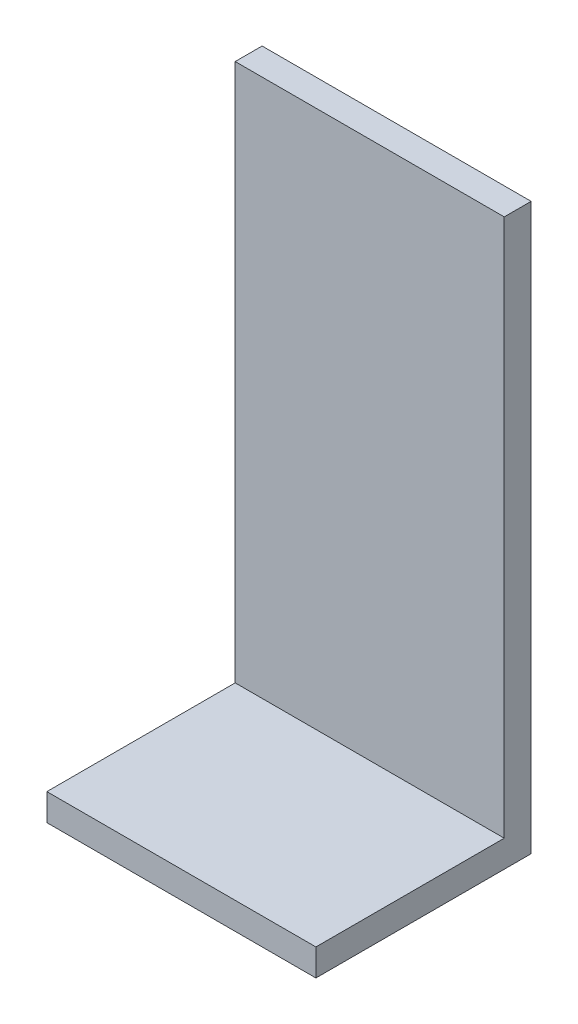
ISO-10303-21;
HEADER;
FILE_DESCRIPTION(('STEP AP214'),'2;1');
FILE_NAME('part.step','',(''),(''),'','','');
FILE_SCHEMA(('AUTOMOTIVE_DESIGN { 1 0 10303 214 1 1 1 1 }'));
ENDSEC;
DATA;
#1=APPLICATION_CONTEXT('core data for automotive mechanical design processes');
#2=APPLICATION_PROTOCOL_DEFINITION('international standard','automotive_design',2000,#1);
#3=PRODUCT_CONTEXT('',#1,'mechanical');
#4=PRODUCT('Part','Part','',(#3));
#5=PRODUCT_RELATED_PRODUCT_CATEGORY('part','',(#4));
#6=PRODUCT_DEFINITION_FORMATION('','',#4);
#7=PRODUCT_DEFINITION_CONTEXT('part definition',#1,'design');
#8=PRODUCT_DEFINITION('design','',#6,#7);
#9=PRODUCT_DEFINITION_SHAPE('','',#8);
#10=(LENGTH_UNIT() NAMED_UNIT(*) SI_UNIT(.MILLI.,.METRE.));
#11=(NAMED_UNIT(*) PLANE_ANGLE_UNIT() SI_UNIT($,.RADIAN.));
#12=(NAMED_UNIT(*) SI_UNIT($,.STERADIAN.) SOLID_ANGLE_UNIT());
#13=UNCERTAINTY_MEASURE_WITH_UNIT(LENGTH_MEASURE(1.E-05),#10,'distance_accuracy_value','');
#14=(GEOMETRIC_REPRESENTATION_CONTEXT(3) GLOBAL_UNCERTAINTY_ASSIGNED_CONTEXT((#13)) GLOBAL_UNIT_ASSIGNED_CONTEXT((#10,
#11,#12)) REPRESENTATION_CONTEXT('',''));
#15=CARTESIAN_POINT('',(0.,0.,0.));
#16=DIRECTION('',(0.,0.,1.));
#17=DIRECTION('',(1.,0.,0.));
#18=AXIS2_PLACEMENT_3D('',#15,#16,#17);
#19=CARTESIAN_POINT('',(31.75,0.,3.175));
#20=DIRECTION('',(-1.,0.,0.));
#21=DIRECTION('',(0.,0.,1.));
#22=AXIS2_PLACEMENT_3D('',#19,#20,#21);
#23=PLANE('',#22);
#24=DIRECTION('',(0.,1.,0.));
#25=VECTOR('',#24,1.);
#26=CARTESIAN_POINT('',(31.75,0.,0.));
#27=LINE('',#26,#25);
#28=CARTESIAN_POINT('',(31.75,-3.175,0.));
#29=VERTEX_POINT('',#28);
#30=CARTESIAN_POINT('',(31.75,63.5,0.));
#31=VERTEX_POINT('',#30);
#32=EDGE_CURVE('E84',#29,#31,#27,.T.);
#33=ORIENTED_EDGE('',*,*,#32,.T.);
#34=DIRECTION('',(0.,0.,-1.));
#35=VECTOR('',#34,1.);
#36=CARTESIAN_POINT('',(31.75,63.5,3.175));
#37=LINE('',#36,#35);
#38=CARTESIAN_POINT('',(31.75,63.5,3.175));
#39=VERTEX_POINT('',#38);
#40=EDGE_CURVE('E11',#39,#31,#37,.T.);
#41=ORIENTED_EDGE('',*,*,#40,.F.);
#42=DIRECTION('',(0.,1.,0.));
#43=VECTOR('',#42,1.);
#44=CARTESIAN_POINT('',(31.75,0.,3.175));
#45=LINE('',#44,#43);
#46=CARTESIAN_POINT('',(31.75,0.,3.175));
#47=VERTEX_POINT('',#46);
#48=EDGE_CURVE('E87',#47,#39,#45,.T.);
#49=ORIENTED_EDGE('',*,*,#48,.F.);
#50=DIRECTION('',(0.,0.,-1.));
#51=VECTOR('',#50,1.);
#52=CARTESIAN_POINT('',(31.75,0.,25.4));
#53=LINE('',#52,#51);
#54=CARTESIAN_POINT('',(31.75,0.,25.4));
#55=VERTEX_POINT('',#54);
#56=EDGE_CURVE('E75',#55,#47,#53,.T.);
#57=ORIENTED_EDGE('',*,*,#56,.F.);
#58=DIRECTION('',(0.,-1.,0.));
#59=VECTOR('',#58,1.);
#60=CARTESIAN_POINT('',(31.75,0.,25.4));
#61=LINE('',#60,#59);
#62=CARTESIAN_POINT('',(31.75,-3.175,25.4));
#63=VERTEX_POINT('',#62);
#64=EDGE_CURVE('E122',#55,#63,#61,.T.);
#65=ORIENTED_EDGE('',*,*,#64,.T.);
#66=DIRECTION('',(0.,0.,-1.));
#67=VECTOR('',#66,1.);
#68=CARTESIAN_POINT('',(31.75,-3.175,25.4));
#69=LINE('',#68,#67);
#70=EDGE_CURVE('E129',#63,#29,#69,.T.);
#71=ORIENTED_EDGE('',*,*,#70,.T.);
#72=EDGE_LOOP('',(#33,#41,#49,#57,#65,#71));
#73=FACE_BOUND('',#72,.T.);
#74=ADVANCED_FACE('F33',(#73),#23,.F.);
#75=CARTESIAN_POINT('',(0.,63.5,3.175));
#76=DIRECTION('',(0.,1.,0.));
#77=DIRECTION('',(0.,0.,1.));
#78=AXIS2_PLACEMENT_3D('',#75,#76,#77);
#79=PLANE('',#78);
#80=DIRECTION('',(1.,0.,0.));
#81=VECTOR('',#80,1.);
#82=CARTESIAN_POINT('',(0.,63.5,0.));
#83=LINE('',#82,#81);
#84=CARTESIAN_POINT('',(0.,63.5,0.));
#85=VERTEX_POINT('',#84);
#86=EDGE_CURVE('E98',#85,#31,#83,.T.);
#87=ORIENTED_EDGE('',*,*,#86,.F.);
#88=DIRECTION('',(0.,0.,-1.));
#89=VECTOR('',#88,1.);
#90=CARTESIAN_POINT('',(0.,63.5,3.175));
#91=LINE('',#90,#89);
#92=CARTESIAN_POINT('',(0.,63.5,3.175));
#93=VERTEX_POINT('',#92);
#94=EDGE_CURVE('E41',#93,#85,#91,.T.);
#95=ORIENTED_EDGE('',*,*,#94,.F.);
#96=DIRECTION('',(1.,0.,0.));
#97=VECTOR('',#96,1.);
#98=CARTESIAN_POINT('',(0.,63.5,3.175));
#99=LINE('',#98,#97);
#100=EDGE_CURVE('E89',#93,#39,#99,.T.);
#101=ORIENTED_EDGE('',*,*,#100,.T.);
#102=ORIENTED_EDGE('',*,*,#40,.T.);
#103=EDGE_LOOP('',(#87,#95,#101,#102));
#104=FACE_BOUND('',#103,.T.);
#105=ADVANCED_FACE('F112',(#104),#79,.T.);
#106=CARTESIAN_POINT('',(0.,0.,3.175));
#107=DIRECTION('',(-1.,0.,0.));
#108=DIRECTION('',(0.,0.,1.));
#109=AXIS2_PLACEMENT_3D('',#106,#107,#108);
#110=PLANE('',#109);
#111=DIRECTION('',(0.,1.,0.));
#112=VECTOR('',#111,1.);
#113=CARTESIAN_POINT('',(0.,0.,0.));
#114=LINE('',#113,#112);
#115=CARTESIAN_POINT('',(0.,-3.175,0.));
#116=VERTEX_POINT('',#115);
#117=EDGE_CURVE('E95',#116,#85,#114,.T.);
#118=ORIENTED_EDGE('',*,*,#117,.F.);
#119=DIRECTION('',(0.,0.,-1.));
#120=VECTOR('',#119,1.);
#121=CARTESIAN_POINT('',(0.,-3.175,25.4));
#122=LINE('',#121,#120);
#123=CARTESIAN_POINT('',(0.,-3.175,25.4));
#124=VERTEX_POINT('',#123);
#125=EDGE_CURVE('E131',#124,#116,#122,.T.);
#126=ORIENTED_EDGE('',*,*,#125,.F.);
#127=DIRECTION('',(0.,-1.,0.));
#128=VECTOR('',#127,1.);
#129=CARTESIAN_POINT('',(0.,0.,25.4));
#130=LINE('',#129,#128);
#131=CARTESIAN_POINT('',(0.,0.,25.4));
#132=VERTEX_POINT('',#131);
#133=EDGE_CURVE('E135',#132,#124,#130,.T.);
#134=ORIENTED_EDGE('',*,*,#133,.F.);
#135=DIRECTION('',(0.,0.,-1.));
#136=VECTOR('',#135,1.);
#137=CARTESIAN_POINT('',(0.,0.,25.4));
#138=LINE('',#137,#136);
#139=CARTESIAN_POINT('',(0.,0.,3.175));
#140=VERTEX_POINT('',#139);
#141=EDGE_CURVE('E85',#132,#140,#138,.T.);
#142=ORIENTED_EDGE('',*,*,#141,.T.);
#143=DIRECTION('',(0.,1.,0.));
#144=VECTOR('',#143,1.);
#145=CARTESIAN_POINT('',(0.,0.,3.175));
#146=LINE('',#145,#144);
#147=EDGE_CURVE('E94',#140,#93,#146,.T.);
#148=ORIENTED_EDGE('',*,*,#147,.T.);
#149=ORIENTED_EDGE('',*,*,#94,.T.);
#150=EDGE_LOOP('',(#118,#126,#134,#142,#148,#149));
#151=FACE_BOUND('',#150,.T.);
#152=ADVANCED_FACE('F108',(#151),#110,.T.);
#153=CARTESIAN_POINT('',(0.,0.,3.175));
#154=DIRECTION('',(0.,0.,1.));
#155=DIRECTION('',(1.,0.,0.));
#156=AXIS2_PLACEMENT_3D('',#153,#154,#155);
#157=PLANE('',#156);
#158=DIRECTION('',(1.,0.,0.));
#159=VECTOR('',#158,1.);
#160=CARTESIAN_POINT('',(0.,0.,3.175));
#161=LINE('',#160,#159);
#162=EDGE_CURVE('E65',#140,#47,#161,.T.);
#163=ORIENTED_EDGE('',*,*,#162,.T.);
#164=ORIENTED_EDGE('',*,*,#48,.T.);
#165=ORIENTED_EDGE('',*,*,#100,.F.);
#166=ORIENTED_EDGE('',*,*,#147,.F.);
#167=EDGE_LOOP('',(#163,#164,#165,#166));
#168=FACE_BOUND('',#167,.T.);
#169=ADVANCED_FACE('F92',(#168),#157,.T.);
#170=CARTESIAN_POINT('',(0.,0.,0.));
#171=DIRECTION('',(0.,0.,1.));
#172=DIRECTION('',(1.,0.,0.));
#173=AXIS2_PLACEMENT_3D('',#170,#171,#172);
#174=PLANE('',#173);
#175=ORIENTED_EDGE('',*,*,#32,.F.);
#176=DIRECTION('',(1.,0.,0.));
#177=VECTOR('',#176,1.);
#178=CARTESIAN_POINT('',(0.,-3.175,0.));
#179=LINE('',#178,#177);
#180=EDGE_CURVE('E118',#116,#29,#179,.T.);
#181=ORIENTED_EDGE('',*,*,#180,.F.);
#182=ORIENTED_EDGE('',*,*,#117,.T.);
#183=ORIENTED_EDGE('',*,*,#86,.T.);
#184=EDGE_LOOP('',(#175,#181,#182,#183));
#185=FACE_BOUND('',#184,.T.);
#186=ADVANCED_FACE('F116',(#185),#174,.F.);
#187=CARTESIAN_POINT('',(0.,0.,25.4));
#188=DIRECTION('',(0.,1.,0.));
#189=DIRECTION('',(0.,0.,1.));
#190=AXIS2_PLACEMENT_3D('',#187,#188,#189);
#191=PLANE('',#190);
#192=ORIENTED_EDGE('',*,*,#162,.F.);
#193=ORIENTED_EDGE('',*,*,#141,.F.);
#194=DIRECTION('',(1.,0.,0.));
#195=VECTOR('',#194,1.);
#196=CARTESIAN_POINT('',(0.,0.,25.4));
#197=LINE('',#196,#195);
#198=EDGE_CURVE('E80',#132,#55,#197,.T.);
#199=ORIENTED_EDGE('',*,*,#198,.T.);
#200=ORIENTED_EDGE('',*,*,#56,.T.);
#201=EDGE_LOOP('',(#192,#193,#199,#200));
#202=FACE_BOUND('',#201,.T.);
#203=ADVANCED_FACE('F77',(#202),#191,.T.);
#204=CARTESIAN_POINT('',(0.,-3.175,25.4));
#205=DIRECTION('',(0.,1.,0.));
#206=DIRECTION('',(0.,0.,1.));
#207=AXIS2_PLACEMENT_3D('',#204,#205,#206);
#208=PLANE('',#207);
#209=ORIENTED_EDGE('',*,*,#180,.T.);
#210=ORIENTED_EDGE('',*,*,#70,.F.);
#211=DIRECTION('',(1.,0.,0.));
#212=VECTOR('',#211,1.);
#213=CARTESIAN_POINT('',(0.,-3.175,25.4));
#214=LINE('',#213,#212);
#215=EDGE_CURVE('E127',#124,#63,#214,.T.);
#216=ORIENTED_EDGE('',*,*,#215,.F.);
#217=ORIENTED_EDGE('',*,*,#125,.T.);
#218=EDGE_LOOP('',(#209,#210,#216,#217));
#219=FACE_BOUND('',#218,.T.);
#220=ADVANCED_FACE('F142',(#219),#208,.F.);
#221=CARTESIAN_POINT('',(0.,0.,25.4));
#222=DIRECTION('',(0.,0.,1.));
#223=DIRECTION('',(1.,0.,0.));
#224=AXIS2_PLACEMENT_3D('',#221,#222,#223);
#225=PLANE('',#224);
#226=ORIENTED_EDGE('',*,*,#64,.F.);
#227=ORIENTED_EDGE('',*,*,#198,.F.);
#228=ORIENTED_EDGE('',*,*,#133,.T.);
#229=ORIENTED_EDGE('',*,*,#215,.T.);
#230=EDGE_LOOP('',(#226,#227,#228,#229));
#231=FACE_BOUND('',#230,.T.);
#232=ADVANCED_FACE('F140',(#231),#225,.T.);
#233=CLOSED_SHELL('',(#74,#105,#152,#169,#186,#203,#220,#232));
#234=MANIFOLD_SOLID_BREP('B2',#233);
#235=ADVANCED_BREP_SHAPE_REPRESENTATION('',(#18,#234),#14);
#236=SHAPE_DEFINITION_REPRESENTATION(#9,#235);
ENDSEC;
END-ISO-10303-21;
